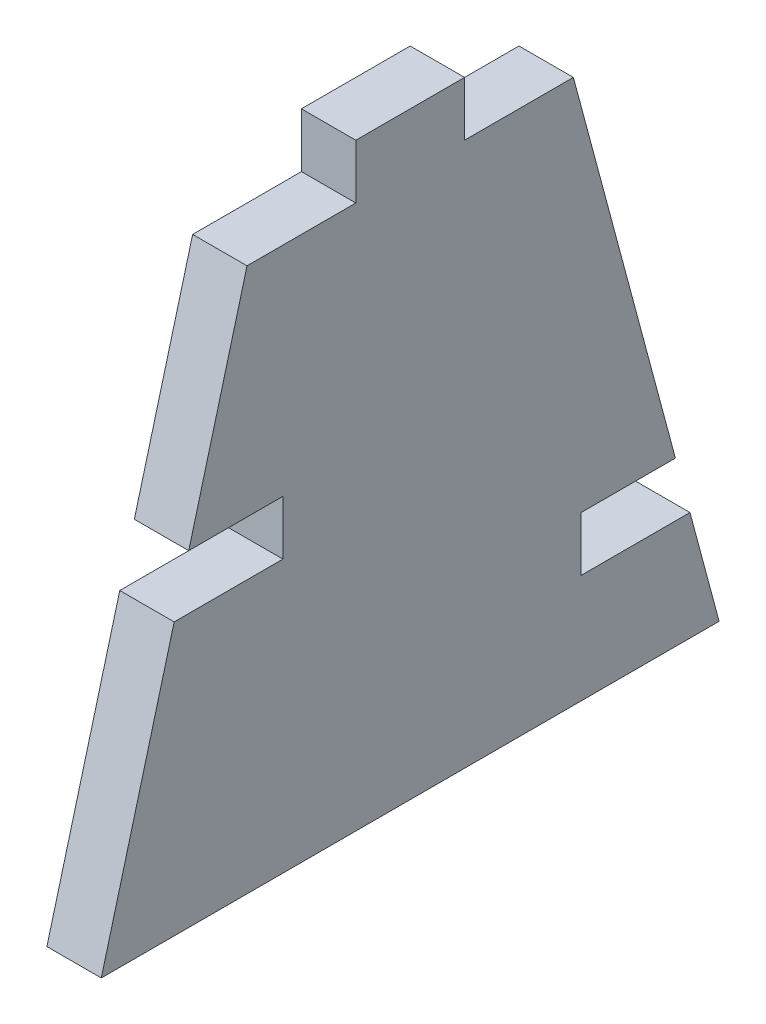
ISO-10303-21;
HEADER;
FILE_DESCRIPTION(('STEP AP214'),'2;1');
FILE_NAME('part.step','',(''),(''),'','','');
FILE_SCHEMA(('AUTOMOTIVE_DESIGN { 1 0 10303 214 1 1 1 1 }'));
ENDSEC;
DATA;
#1=APPLICATION_CONTEXT('core data for automotive mechanical design processes');
#2=APPLICATION_PROTOCOL_DEFINITION('international standard','automotive_design',2000,#1);
#3=PRODUCT_CONTEXT('',#1,'mechanical');
#4=PRODUCT('Part','Part','',(#3));
#5=PRODUCT_RELATED_PRODUCT_CATEGORY('part','',(#4));
#6=PRODUCT_DEFINITION_FORMATION('','',#4);
#7=PRODUCT_DEFINITION_CONTEXT('part definition',#1,'design');
#8=PRODUCT_DEFINITION('design','',#6,#7);
#9=PRODUCT_DEFINITION_SHAPE('','',#8);
#10=(LENGTH_UNIT() NAMED_UNIT(*) SI_UNIT(.MILLI.,.METRE.));
#11=(NAMED_UNIT(*) PLANE_ANGLE_UNIT() SI_UNIT($,.RADIAN.));
#12=(NAMED_UNIT(*) SI_UNIT($,.STERADIAN.) SOLID_ANGLE_UNIT());
#13=UNCERTAINTY_MEASURE_WITH_UNIT(LENGTH_MEASURE(1.E-05),#10,'distance_accuracy_value','');
#14=(GEOMETRIC_REPRESENTATION_CONTEXT(3) GLOBAL_UNCERTAINTY_ASSIGNED_CONTEXT((#13)) GLOBAL_UNIT_ASSIGNED_CONTEXT((#10,
#11,#12)) REPRESENTATION_CONTEXT('',''));
#15=CARTESIAN_POINT('',(0.,0.,0.));
#16=DIRECTION('',(0.,0.,1.));
#17=DIRECTION('',(1.,0.,0.));
#18=AXIS2_PLACEMENT_3D('',#15,#16,#17);
#19=CARTESIAN_POINT('',(10.,60.,40.7179676972451));
#20=DIRECTION('',(0.,-0.258819045102524,-0.965925826289067));
#21=DIRECTION('',(0.,0.965925826289067,-0.258819045102524));
#22=AXIS2_PLACEMENT_3D('',#19,#20,#21);
#23=PLANE('',#22);
#24=DIRECTION('',(0.,-0.965925826289067,0.258819045102524));
#25=VECTOR('',#24,1.);
#26=CARTESIAN_POINT('',(0.,60.,40.7179676972451));
#27=LINE('',#26,#25);
#28=CARTESIAN_POINT('',(0.,100.,30.));
#29=VERTEX_POINT('',#28);
#30=CARTESIAN_POINT('',(0.,60.,40.7179676972451));
#31=VERTEX_POINT('',#30);
#32=EDGE_CURVE('E191',#29,#31,#27,.T.);
#33=ORIENTED_EDGE('',*,*,#32,.T.);
#34=DIRECTION('',(-1.,0.,0.));
#35=VECTOR('',#34,1.);
#36=CARTESIAN_POINT('',(10.,60.,40.7179676972451));
#37=LINE('',#36,#35);
#38=CARTESIAN_POINT('',(10.,60.,40.7179676972451));
#39=VERTEX_POINT('',#38);
#40=EDGE_CURVE('E11',#39,#31,#37,.T.);
#41=ORIENTED_EDGE('',*,*,#40,.F.);
#42=DIRECTION('',(0.,-0.965925826289067,0.258819045102524));
#43=VECTOR('',#42,1.);
#44=CARTESIAN_POINT('',(10.,60.,40.7179676972451));
#45=LINE('',#44,#43);
#46=CARTESIAN_POINT('',(10.,100.,30.));
#47=VERTEX_POINT('',#46);
#48=EDGE_CURVE('E237',#47,#39,#45,.T.);
#49=ORIENTED_EDGE('',*,*,#48,.F.);
#50=DIRECTION('',(-1.,0.,0.));
#51=VECTOR('',#50,1.);
#52=CARTESIAN_POINT('',(10.,100.,30.));
#53=LINE('',#52,#51);
#54=EDGE_CURVE('E187',#47,#29,#53,.T.);
#55=ORIENTED_EDGE('',*,*,#54,.T.);
#56=EDGE_LOOP('',(#33,#41,#49,#55));
#57=FACE_BOUND('',#56,.T.);
#58=ADVANCED_FACE('F42',(#57),#23,.F.);
#59=CARTESIAN_POINT('',(10.,60.,40.7179676972451));
#60=DIRECTION('',(0.,1.,0.));
#61=DIRECTION('',(0.,0.,1.));
#62=AXIS2_PLACEMENT_3D('',#59,#60,#61);
#63=PLANE('',#62);
#64=DIRECTION('',(0.,0.,-1.));
#65=VECTOR('',#64,1.);
#66=CARTESIAN_POINT('',(0.,60.,40.7179676972451));
#67=LINE('',#66,#65);
#68=CARTESIAN_POINT('',(0.,60.,23.3974596215564));
#69=VERTEX_POINT('',#68);
#70=EDGE_CURVE('E195',#31,#69,#67,.T.);
#71=ORIENTED_EDGE('',*,*,#70,.T.);
#72=DIRECTION('',(-1.,0.,0.));
#73=VECTOR('',#72,1.);
#74=CARTESIAN_POINT('',(10.,60.,23.3974596215564));
#75=LINE('',#74,#73);
#76=CARTESIAN_POINT('',(10.,60.,23.3974596215564));
#77=VERTEX_POINT('',#76);
#78=EDGE_CURVE('E51',#77,#69,#75,.T.);
#79=ORIENTED_EDGE('',*,*,#78,.F.);
#80=DIRECTION('',(0.,0.,-1.));
#81=VECTOR('',#80,1.);
#82=CARTESIAN_POINT('',(10.,60.,40.7179676972451));
#83=LINE('',#82,#81);
#84=EDGE_CURVE('E126',#39,#77,#83,.T.);
#85=ORIENTED_EDGE('',*,*,#84,.F.);
#86=ORIENTED_EDGE('',*,*,#40,.T.);
#87=EDGE_LOOP('',(#71,#79,#85,#86));
#88=FACE_BOUND('',#87,.T.);
#89=ADVANCED_FACE('F359',(#88),#63,.F.);
#90=CARTESIAN_POINT('',(10.,60.,23.3974596215564));
#91=DIRECTION('',(0.,0.,-1.));
#92=DIRECTION('',(-1.,0.,0.));
#93=AXIS2_PLACEMENT_3D('',#90,#91,#92);
#94=PLANE('',#93);
#95=DIRECTION('',(0.,-1.,0.));
#96=VECTOR('',#95,1.);
#97=CARTESIAN_POINT('',(0.,60.,23.3974596215564));
#98=LINE('',#97,#96);
#99=CARTESIAN_POINT('',(0.,50.,23.3974596215564));
#100=VERTEX_POINT('',#99);
#101=EDGE_CURVE('E198',#69,#100,#98,.T.);
#102=ORIENTED_EDGE('',*,*,#101,.T.);
#103=DIRECTION('',(-1.,0.,0.));
#104=VECTOR('',#103,1.);
#105=CARTESIAN_POINT('',(10.,50.,23.3974596215564));
#106=LINE('',#105,#104);
#107=CARTESIAN_POINT('',(10.,50.,23.3974596215564));
#108=VERTEX_POINT('',#107);
#109=EDGE_CURVE('E280',#108,#100,#106,.T.);
#110=ORIENTED_EDGE('',*,*,#109,.F.);
#111=DIRECTION('',(0.,-1.,0.));
#112=VECTOR('',#111,1.);
#113=CARTESIAN_POINT('',(10.,60.,23.3974596215564));
#114=LINE('',#113,#112);
#115=EDGE_CURVE('E290',#77,#108,#114,.T.);
#116=ORIENTED_EDGE('',*,*,#115,.F.);
#117=ORIENTED_EDGE('',*,*,#78,.T.);
#118=EDGE_LOOP('',(#102,#110,#116,#117));
#119=FACE_BOUND('',#118,.T.);
#120=ADVANCED_FACE('F288',(#119),#94,.F.);
#121=CARTESIAN_POINT('',(10.,50.,23.3974596215564));
#122=DIRECTION('',(0.,-1.,0.));
#123=DIRECTION('',(0.,0.,-1.));
#124=AXIS2_PLACEMENT_3D('',#121,#122,#123);
#125=PLANE('',#124);
#126=DIRECTION('',(0.,0.,1.));
#127=VECTOR('',#126,1.);
#128=CARTESIAN_POINT('',(0.,50.,23.3974596215564));
#129=LINE('',#128,#127);
#130=CARTESIAN_POINT('',(0.,50.,43.3974596215564));
#131=VERTEX_POINT('',#130);
#132=EDGE_CURVE('E201',#100,#131,#129,.T.);
#133=ORIENTED_EDGE('',*,*,#132,.T.);
#134=DIRECTION('',(-1.,0.,0.));
#135=VECTOR('',#134,1.);
#136=CARTESIAN_POINT('',(10.,50.,43.3974596215564));
#137=LINE('',#136,#135);
#138=CARTESIAN_POINT('',(10.,50.,43.3974596215564));
#139=VERTEX_POINT('',#138);
#140=EDGE_CURVE('E276',#139,#131,#137,.T.);
#141=ORIENTED_EDGE('',*,*,#140,.F.);
#142=DIRECTION('',(0.,0.,1.));
#143=VECTOR('',#142,1.);
#144=CARTESIAN_POINT('',(10.,50.,23.3974596215564));
#145=LINE('',#144,#143);
#146=EDGE_CURVE('E309',#108,#139,#145,.T.);
#147=ORIENTED_EDGE('',*,*,#146,.F.);
#148=ORIENTED_EDGE('',*,*,#109,.T.);
#149=EDGE_LOOP('',(#133,#141,#147,#148));
#150=FACE_BOUND('',#149,.T.);
#151=ADVANCED_FACE('F299',(#150),#125,.F.);
#152=CARTESIAN_POINT('',(10.,0.,56.7949192431127));
#153=DIRECTION('',(0.,-0.258819045102525,-0.965925826289067));
#154=DIRECTION('',(0.,0.965925826289067,-0.258819045102525));
#155=AXIS2_PLACEMENT_3D('',#152,#153,#154);
#156=PLANE('',#155);
#157=DIRECTION('',(0.,-0.965925826289067,0.258819045102525));
#158=VECTOR('',#157,1.);
#159=CARTESIAN_POINT('',(0.,0.,56.7949192431127));
#160=LINE('',#159,#158);
#161=CARTESIAN_POINT('',(0.,0.,56.7949192431127));
#162=VERTEX_POINT('',#161);
#163=EDGE_CURVE('E204',#131,#162,#160,.T.);
#164=ORIENTED_EDGE('',*,*,#163,.T.);
#165=DIRECTION('',(-1.,0.,0.));
#166=VECTOR('',#165,1.);
#167=CARTESIAN_POINT('',(10.,0.,56.7949192431127));
#168=LINE('',#167,#166);
#169=CARTESIAN_POINT('',(10.,0.,56.7949192431127));
#170=VERTEX_POINT('',#169);
#171=EDGE_CURVE('E272',#170,#162,#168,.T.);
#172=ORIENTED_EDGE('',*,*,#171,.F.);
#173=DIRECTION('',(0.,-0.965925826289067,0.258819045102525));
#174=VECTOR('',#173,1.);
#175=CARTESIAN_POINT('',(10.,0.,56.7949192431127));
#176=LINE('',#175,#174);
#177=EDGE_CURVE('E305',#139,#170,#176,.T.);
#178=ORIENTED_EDGE('',*,*,#177,.F.);
#179=ORIENTED_EDGE('',*,*,#140,.T.);
#180=EDGE_LOOP('',(#164,#172,#178,#179));
#181=FACE_BOUND('',#180,.T.);
#182=ADVANCED_FACE('F303',(#181),#156,.F.);
#183=CARTESIAN_POINT('',(10.,0.,-56.7949192431127));
#184=DIRECTION('',(0.,1.,0.));
#185=DIRECTION('',(0.,0.,1.));
#186=AXIS2_PLACEMENT_3D('',#183,#184,#185);
#187=PLANE('',#186);
#188=DIRECTION('',(0.,0.,-1.));
#189=VECTOR('',#188,1.);
#190=CARTESIAN_POINT('',(0.,0.,-56.7949192431127));
#191=LINE('',#190,#189);
#192=CARTESIAN_POINT('',(0.,0.,-56.7949192431127));
#193=VERTEX_POINT('',#192);
#194=EDGE_CURVE('E207',#162,#193,#191,.T.);
#195=ORIENTED_EDGE('',*,*,#194,.T.);
#196=DIRECTION('',(-1.,0.,0.));
#197=VECTOR('',#196,1.);
#198=CARTESIAN_POINT('',(10.,0.,-56.7949192431127));
#199=LINE('',#198,#197);
#200=CARTESIAN_POINT('',(10.,0.,-56.7949192431127));
#201=VERTEX_POINT('',#200);
#202=EDGE_CURVE('E268',#201,#193,#199,.T.);
#203=ORIENTED_EDGE('',*,*,#202,.F.);
#204=DIRECTION('',(0.,0.,-1.));
#205=VECTOR('',#204,1.);
#206=CARTESIAN_POINT('',(10.,0.,-56.7949192431127));
#207=LINE('',#206,#205);
#208=EDGE_CURVE('E308',#170,#201,#207,.T.);
#209=ORIENTED_EDGE('',*,*,#208,.F.);
#210=ORIENTED_EDGE('',*,*,#171,.T.);
#211=EDGE_LOOP('',(#195,#203,#209,#210));
#212=FACE_BOUND('',#211,.T.);
#213=ADVANCED_FACE('F372',(#212),#187,.F.);
#214=CARTESIAN_POINT('',(10.,0.,-56.7949192431127));
#215=DIRECTION('',(0.,-0.258819045102525,0.965925826289067));
#216=DIRECTION('',(0.,-0.965925826289067,-0.258819045102525));
#217=AXIS2_PLACEMENT_3D('',#214,#215,#216);
#218=PLANE('',#217);
#219=DIRECTION('',(0.,0.965925826289067,0.258819045102525));
#220=VECTOR('',#219,1.);
#221=CARTESIAN_POINT('',(0.,0.,-56.7949192431127));
#222=LINE('',#221,#220);
#223=CARTESIAN_POINT('',(0.,20.,-51.4359353944902));
#224=VERTEX_POINT('',#223);
#225=EDGE_CURVE('E210',#193,#224,#222,.T.);
#226=ORIENTED_EDGE('',*,*,#225,.T.);
#227=DIRECTION('',(-1.,0.,0.));
#228=VECTOR('',#227,1.);
#229=CARTESIAN_POINT('',(10.,20.,-51.4359353944902));
#230=LINE('',#229,#228);
#231=CARTESIAN_POINT('',(10.,20.,-51.4359353944902));
#232=VERTEX_POINT('',#231);
#233=EDGE_CURVE('E264',#232,#224,#230,.T.);
#234=ORIENTED_EDGE('',*,*,#233,.F.);
#235=DIRECTION('',(0.,0.965925826289067,0.258819045102525));
#236=VECTOR('',#235,1.);
#237=CARTESIAN_POINT('',(10.,0.,-56.7949192431127));
#238=LINE('',#237,#236);
#239=EDGE_CURVE('E313',#201,#232,#238,.T.);
#240=ORIENTED_EDGE('',*,*,#239,.F.);
#241=ORIENTED_EDGE('',*,*,#202,.T.);
#242=EDGE_LOOP('',(#226,#234,#240,#241));
#243=FACE_BOUND('',#242,.T.);
#244=ADVANCED_FACE('F375',(#243),#218,.F.);
#245=CARTESIAN_POINT('',(10.,20.,-31.4359353944901));
#246=DIRECTION('',(0.,-1.,0.));
#247=DIRECTION('',(0.,0.,-1.));
#248=AXIS2_PLACEMENT_3D('',#245,#246,#247);
#249=PLANE('',#248);
#250=DIRECTION('',(0.,0.,1.));
#251=VECTOR('',#250,1.);
#252=CARTESIAN_POINT('',(0.,20.,-31.4359353944901));
#253=LINE('',#252,#251);
#254=CARTESIAN_POINT('',(0.,20.,-31.4359353944901));
#255=VERTEX_POINT('',#254);
#256=EDGE_CURVE('E213',#224,#255,#253,.T.);
#257=ORIENTED_EDGE('',*,*,#256,.T.);
#258=DIRECTION('',(-1.,0.,0.));
#259=VECTOR('',#258,1.);
#260=CARTESIAN_POINT('',(10.,20.,-31.4359353944901));
#261=LINE('',#260,#259);
#262=CARTESIAN_POINT('',(10.,20.,-31.4359353944901));
#263=VERTEX_POINT('',#262);
#264=EDGE_CURVE('E260',#263,#255,#261,.T.);
#265=ORIENTED_EDGE('',*,*,#264,.F.);
#266=DIRECTION('',(0.,0.,1.));
#267=VECTOR('',#266,1.);
#268=CARTESIAN_POINT('',(10.,20.,-31.4359353944901));
#269=LINE('',#268,#267);
#270=EDGE_CURVE('E320',#232,#263,#269,.T.);
#271=ORIENTED_EDGE('',*,*,#270,.F.);
#272=ORIENTED_EDGE('',*,*,#233,.T.);
#273=EDGE_LOOP('',(#257,#265,#271,#272));
#274=FACE_BOUND('',#273,.T.);
#275=ADVANCED_FACE('F379',(#274),#249,.F.);
#276=CARTESIAN_POINT('',(10.,30.,-31.4359353944901));
#277=DIRECTION('',(0.,0.,1.));
#278=DIRECTION('',(1.,0.,0.));
#279=AXIS2_PLACEMENT_3D('',#276,#277,#278);
#280=PLANE('',#279);
#281=DIRECTION('',(0.,1.,0.));
#282=VECTOR('',#281,1.);
#283=CARTESIAN_POINT('',(0.,30.,-31.4359353944901));
#284=LINE('',#283,#282);
#285=CARTESIAN_POINT('',(0.,30.,-31.4359353944901));
#286=VERTEX_POINT('',#285);
#287=EDGE_CURVE('E216',#255,#286,#284,.T.);
#288=ORIENTED_EDGE('',*,*,#287,.T.);
#289=DIRECTION('',(-1.,0.,0.));
#290=VECTOR('',#289,1.);
#291=CARTESIAN_POINT('',(10.,30.,-31.4359353944901));
#292=LINE('',#291,#290);
#293=CARTESIAN_POINT('',(10.,30.,-31.4359353944901));
#294=VERTEX_POINT('',#293);
#295=EDGE_CURVE('E256',#294,#286,#292,.T.);
#296=ORIENTED_EDGE('',*,*,#295,.F.);
#297=DIRECTION('',(0.,1.,0.));
#298=VECTOR('',#297,1.);
#299=CARTESIAN_POINT('',(10.,30.,-31.4359353944901));
#300=LINE('',#299,#298);
#301=EDGE_CURVE('E323',#263,#294,#300,.T.);
#302=ORIENTED_EDGE('',*,*,#301,.F.);
#303=ORIENTED_EDGE('',*,*,#264,.T.);
#304=EDGE_LOOP('',(#288,#296,#302,#303));
#305=FACE_BOUND('',#304,.T.);
#306=ADVANCED_FACE('F383',(#305),#280,.F.);
#307=CARTESIAN_POINT('',(10.,30.,-48.7564434701789));
#308=DIRECTION('',(0.,1.,0.));
#309=DIRECTION('',(0.,0.,1.));
#310=AXIS2_PLACEMENT_3D('',#307,#308,#309);
#311=PLANE('',#310);
#312=DIRECTION('',(0.,0.,-1.));
#313=VECTOR('',#312,1.);
#314=CARTESIAN_POINT('',(0.,30.,-48.7564434701789));
#315=LINE('',#314,#313);
#316=CARTESIAN_POINT('',(0.,30.,-48.7564434701789));
#317=VERTEX_POINT('',#316);
#318=EDGE_CURVE('E219',#286,#317,#315,.T.);
#319=ORIENTED_EDGE('',*,*,#318,.T.);
#320=DIRECTION('',(-1.,0.,0.));
#321=VECTOR('',#320,1.);
#322=CARTESIAN_POINT('',(10.,30.,-48.7564434701789));
#323=LINE('',#322,#321);
#324=CARTESIAN_POINT('',(10.,30.,-48.7564434701789));
#325=VERTEX_POINT('',#324);
#326=EDGE_CURVE('E252',#325,#317,#323,.T.);
#327=ORIENTED_EDGE('',*,*,#326,.F.);
#328=DIRECTION('',(0.,0.,-1.));
#329=VECTOR('',#328,1.);
#330=CARTESIAN_POINT('',(10.,30.,-48.7564434701789));
#331=LINE('',#330,#329);
#332=EDGE_CURVE('E326',#294,#325,#331,.T.);
#333=ORIENTED_EDGE('',*,*,#332,.F.);
#334=ORIENTED_EDGE('',*,*,#295,.T.);
#335=EDGE_LOOP('',(#319,#327,#333,#334));
#336=FACE_BOUND('',#335,.T.);
#337=ADVANCED_FACE('F387',(#336),#311,.F.);
#338=CARTESIAN_POINT('',(10.,30.,-48.7564434701789));
#339=DIRECTION('',(0.,-0.258819045102525,0.965925826289067));
#340=DIRECTION('',(0.,-0.965925826289067,-0.258819045102525));
#341=AXIS2_PLACEMENT_3D('',#338,#339,#340);
#342=PLANE('',#341);
#343=DIRECTION('',(0.,0.965925826289067,0.258819045102525));
#344=VECTOR('',#343,1.);
#345=CARTESIAN_POINT('',(0.,30.,-48.7564434701789));
#346=LINE('',#345,#344);
#347=CARTESIAN_POINT('',(0.,100.,-30.));
#348=VERTEX_POINT('',#347);
#349=EDGE_CURVE('E222',#317,#348,#346,.T.);
#350=ORIENTED_EDGE('',*,*,#349,.T.);
#351=DIRECTION('',(-1.,0.,0.));
#352=VECTOR('',#351,1.);
#353=CARTESIAN_POINT('',(10.,100.,-30.));
#354=LINE('',#353,#352);
#355=CARTESIAN_POINT('',(10.,100.,-30.));
#356=VERTEX_POINT('',#355);
#357=EDGE_CURVE('E248',#356,#348,#354,.T.);
#358=ORIENTED_EDGE('',*,*,#357,.F.);
#359=DIRECTION('',(0.,0.965925826289067,0.258819045102525));
#360=VECTOR('',#359,1.);
#361=CARTESIAN_POINT('',(10.,30.,-48.7564434701789));
#362=LINE('',#361,#360);
#363=EDGE_CURVE('E329',#325,#356,#362,.T.);
#364=ORIENTED_EDGE('',*,*,#363,.F.);
#365=ORIENTED_EDGE('',*,*,#326,.T.);
#366=EDGE_LOOP('',(#350,#358,#364,#365));
#367=FACE_BOUND('',#366,.T.);
#368=ADVANCED_FACE('F391',(#367),#342,.F.);
#369=CARTESIAN_POINT('',(10.,100.,-30.));
#370=DIRECTION('',(0.,-1.,0.));
#371=DIRECTION('',(0.,0.,-1.));
#372=AXIS2_PLACEMENT_3D('',#369,#370,#371);
#373=PLANE('',#372);
#374=DIRECTION('',(0.,0.,1.));
#375=VECTOR('',#374,1.);
#376=CARTESIAN_POINT('',(0.,100.,-30.));
#377=LINE('',#376,#375);
#378=CARTESIAN_POINT('',(0.,100.,-10.));
#379=VERTEX_POINT('',#378);
#380=EDGE_CURVE('E225',#348,#379,#377,.T.);
#381=ORIENTED_EDGE('',*,*,#380,.T.);
#382=DIRECTION('',(-1.,0.,0.));
#383=VECTOR('',#382,1.);
#384=CARTESIAN_POINT('',(10.,100.,-10.));
#385=LINE('',#384,#383);
#386=CARTESIAN_POINT('',(10.,100.,-10.));
#387=VERTEX_POINT('',#386);
#388=EDGE_CURVE('E244',#387,#379,#385,.T.);
#389=ORIENTED_EDGE('',*,*,#388,.F.);
#390=DIRECTION('',(0.,0.,1.));
#391=VECTOR('',#390,1.);
#392=CARTESIAN_POINT('',(10.,100.,-30.));
#393=LINE('',#392,#391);
#394=EDGE_CURVE('E332',#356,#387,#393,.T.);
#395=ORIENTED_EDGE('',*,*,#394,.F.);
#396=ORIENTED_EDGE('',*,*,#357,.T.);
#397=EDGE_LOOP('',(#381,#389,#395,#396));
#398=FACE_BOUND('',#397,.T.);
#399=ADVANCED_FACE('F340',(#398),#373,.F.);
#400=CARTESIAN_POINT('',(10.,100.,-10.));
#401=DIRECTION('',(0.,0.,1.));
#402=DIRECTION('',(1.,0.,0.));
#403=AXIS2_PLACEMENT_3D('',#400,#401,#402);
#404=PLANE('',#403);
#405=DIRECTION('',(0.,1.,0.));
#406=VECTOR('',#405,1.);
#407=CARTESIAN_POINT('',(0.,100.,-10.));
#408=LINE('',#407,#406);
#409=CARTESIAN_POINT('',(0.,110.,-10.));
#410=VERTEX_POINT('',#409);
#411=EDGE_CURVE('E228',#379,#410,#408,.T.);
#412=ORIENTED_EDGE('',*,*,#411,.T.);
#413=DIRECTION('',(-1.,0.,0.));
#414=VECTOR('',#413,1.);
#415=CARTESIAN_POINT('',(10.,110.,-10.));
#416=LINE('',#415,#414);
#417=CARTESIAN_POINT('',(10.,110.,-10.));
#418=VERTEX_POINT('',#417);
#419=EDGE_CURVE('E180',#418,#410,#416,.T.);
#420=ORIENTED_EDGE('',*,*,#419,.F.);
#421=DIRECTION('',(0.,1.,0.));
#422=VECTOR('',#421,1.);
#423=CARTESIAN_POINT('',(10.,100.,-10.));
#424=LINE('',#423,#422);
#425=EDGE_CURVE('E169',#387,#418,#424,.T.);
#426=ORIENTED_EDGE('',*,*,#425,.F.);
#427=ORIENTED_EDGE('',*,*,#388,.T.);
#428=EDGE_LOOP('',(#412,#420,#426,#427));
#429=FACE_BOUND('',#428,.T.);
#430=ADVANCED_FACE('F344',(#429),#404,.F.);
#431=CARTESIAN_POINT('',(10.,110.,10.));
#432=DIRECTION('',(0.,-1.,0.));
#433=DIRECTION('',(0.,0.,-1.));
#434=AXIS2_PLACEMENT_3D('',#431,#432,#433);
#435=PLANE('',#434);
#436=DIRECTION('',(0.,0.,1.));
#437=VECTOR('',#436,1.);
#438=CARTESIAN_POINT('',(0.,110.,10.));
#439=LINE('',#438,#437);
#440=CARTESIAN_POINT('',(0.,110.,10.));
#441=VERTEX_POINT('',#440);
#442=EDGE_CURVE('E178',#410,#441,#439,.T.);
#443=ORIENTED_EDGE('',*,*,#442,.T.);
#444=DIRECTION('',(-1.,0.,0.));
#445=VECTOR('',#444,1.);
#446=CARTESIAN_POINT('',(10.,110.,10.));
#447=LINE('',#446,#445);
#448=CARTESIAN_POINT('',(10.,110.,10.));
#449=VERTEX_POINT('',#448);
#450=EDGE_CURVE('E175',#449,#441,#447,.T.);
#451=ORIENTED_EDGE('',*,*,#450,.F.);
#452=DIRECTION('',(0.,0.,1.));
#453=VECTOR('',#452,1.);
#454=CARTESIAN_POINT('',(10.,110.,10.));
#455=LINE('',#454,#453);
#456=EDGE_CURVE('E163',#418,#449,#455,.T.);
#457=ORIENTED_EDGE('',*,*,#456,.F.);
#458=ORIENTED_EDGE('',*,*,#419,.T.);
#459=EDGE_LOOP('',(#443,#451,#457,#458));
#460=FACE_BOUND('',#459,.T.);
#461=ADVANCED_FACE('F176',(#460),#435,.F.);
#462=CARTESIAN_POINT('',(10.,100.,10.));
#463=DIRECTION('',(0.,0.,-1.));
#464=DIRECTION('',(-1.,0.,0.));
#465=AXIS2_PLACEMENT_3D('',#462,#463,#464);
#466=PLANE('',#465);
#467=DIRECTION('',(0.,-1.,0.));
#468=VECTOR('',#467,1.);
#469=CARTESIAN_POINT('',(0.,100.,10.));
#470=LINE('',#469,#468);
#471=CARTESIAN_POINT('',(0.,100.,10.));
#472=VERTEX_POINT('',#471);
#473=EDGE_CURVE('E112',#441,#472,#470,.T.);
#474=ORIENTED_EDGE('',*,*,#473,.T.);
#475=DIRECTION('',(-1.,0.,0.));
#476=VECTOR('',#475,1.);
#477=CARTESIAN_POINT('',(10.,100.,10.));
#478=LINE('',#477,#476);
#479=CARTESIAN_POINT('',(10.,100.,10.));
#480=VERTEX_POINT('',#479);
#481=EDGE_CURVE('E181',#480,#472,#478,.T.);
#482=ORIENTED_EDGE('',*,*,#481,.F.);
#483=DIRECTION('',(0.,-1.,0.));
#484=VECTOR('',#483,1.);
#485=CARTESIAN_POINT('',(10.,100.,10.));
#486=LINE('',#485,#484);
#487=EDGE_CURVE('E167',#449,#480,#486,.T.);
#488=ORIENTED_EDGE('',*,*,#487,.F.);
#489=ORIENTED_EDGE('',*,*,#450,.T.);
#490=EDGE_LOOP('',(#474,#482,#488,#489));
#491=FACE_BOUND('',#490,.T.);
#492=ADVANCED_FACE('F183',(#491),#466,.F.);
#493=CARTESIAN_POINT('',(10.,100.,30.));
#494=DIRECTION('',(0.,-1.,0.));
#495=DIRECTION('',(0.,0.,-1.));
#496=AXIS2_PLACEMENT_3D('',#493,#494,#495);
#497=PLANE('',#496);
#498=DIRECTION('',(0.,0.,1.));
#499=VECTOR('',#498,1.);
#500=CARTESIAN_POINT('',(0.,100.,30.));
#501=LINE('',#500,#499);
#502=EDGE_CURVE('E118',#472,#29,#501,.T.);
#503=ORIENTED_EDGE('',*,*,#502,.T.);
#504=ORIENTED_EDGE('',*,*,#54,.F.);
#505=DIRECTION('',(0.,0.,1.));
#506=VECTOR('',#505,1.);
#507=CARTESIAN_POINT('',(10.,100.,30.));
#508=LINE('',#507,#506);
#509=EDGE_CURVE('E59',#480,#47,#508,.T.);
#510=ORIENTED_EDGE('',*,*,#509,.F.);
#511=ORIENTED_EDGE('',*,*,#481,.T.);
#512=EDGE_LOOP('',(#503,#504,#510,#511));
#513=FACE_BOUND('',#512,.T.);
#514=ADVANCED_FACE('F348',(#513),#497,.F.);
#515=CARTESIAN_POINT('',(10.,0.,0.));
#516=DIRECTION('',(-1.,0.,0.));
#517=DIRECTION('',(0.,0.,1.));
#518=AXIS2_PLACEMENT_3D('',#515,#516,#517);
#519=PLANE('',#518);
#520=ORIENTED_EDGE('',*,*,#48,.T.);
#521=ORIENTED_EDGE('',*,*,#84,.T.);
#522=ORIENTED_EDGE('',*,*,#115,.T.);
#523=ORIENTED_EDGE('',*,*,#146,.T.);
#524=ORIENTED_EDGE('',*,*,#177,.T.);
#525=ORIENTED_EDGE('',*,*,#208,.T.);
#526=ORIENTED_EDGE('',*,*,#239,.T.);
#527=ORIENTED_EDGE('',*,*,#270,.T.);
#528=ORIENTED_EDGE('',*,*,#301,.T.);
#529=ORIENTED_EDGE('',*,*,#332,.T.);
#530=ORIENTED_EDGE('',*,*,#363,.T.);
#531=ORIENTED_EDGE('',*,*,#394,.T.);
#532=ORIENTED_EDGE('',*,*,#425,.T.);
#533=ORIENTED_EDGE('',*,*,#456,.T.);
#534=ORIENTED_EDGE('',*,*,#487,.T.);
#535=ORIENTED_EDGE('',*,*,#509,.T.);
#536=EDGE_LOOP('',(#520,#521,#522,#523,#524,#525,#526,#527,#528,#529,#530,#531,#532,#533,#534,#535));
#537=FACE_BOUND('',#536,.T.);
#538=ADVANCED_FACE('F165',(#537),#519,.F.);
#539=CARTESIAN_POINT('',(0.,0.,0.));
#540=DIRECTION('',(-1.,0.,0.));
#541=DIRECTION('',(0.,0.,1.));
#542=AXIS2_PLACEMENT_3D('',#539,#540,#541);
#543=PLANE('',#542);
#544=ORIENTED_EDGE('',*,*,#32,.F.);
#545=ORIENTED_EDGE('',*,*,#502,.F.);
#546=ORIENTED_EDGE('',*,*,#473,.F.);
#547=ORIENTED_EDGE('',*,*,#442,.F.);
#548=ORIENTED_EDGE('',*,*,#411,.F.);
#549=ORIENTED_EDGE('',*,*,#380,.F.);
#550=ORIENTED_EDGE('',*,*,#349,.F.);
#551=ORIENTED_EDGE('',*,*,#318,.F.);
#552=ORIENTED_EDGE('',*,*,#287,.F.);
#553=ORIENTED_EDGE('',*,*,#256,.F.);
#554=ORIENTED_EDGE('',*,*,#225,.F.);
#555=ORIENTED_EDGE('',*,*,#194,.F.);
#556=ORIENTED_EDGE('',*,*,#163,.F.);
#557=ORIENTED_EDGE('',*,*,#132,.F.);
#558=ORIENTED_EDGE('',*,*,#101,.F.);
#559=ORIENTED_EDGE('',*,*,#70,.F.);
#560=EDGE_LOOP('',(#544,#545,#546,#547,#548,#549,#550,#551,#552,#553,#554,#555,#556,#557,#558,#559));
#561=FACE_BOUND('',#560,.T.);
#562=ADVANCED_FACE('F294',(#561),#543,.T.);
#563=CLOSED_SHELL('',(#58,#89,#120,#151,#182,#213,#244,#275,#306,#337,#368,#399,#430,#461,#492,
#514,#538,#562));
#564=MANIFOLD_SOLID_BREP('B2',#563);
#565=ADVANCED_BREP_SHAPE_REPRESENTATION('',(#18,#564),#14);
#566=SHAPE_DEFINITION_REPRESENTATION(#9,#565);
ENDSEC;
END-ISO-10303-21;
